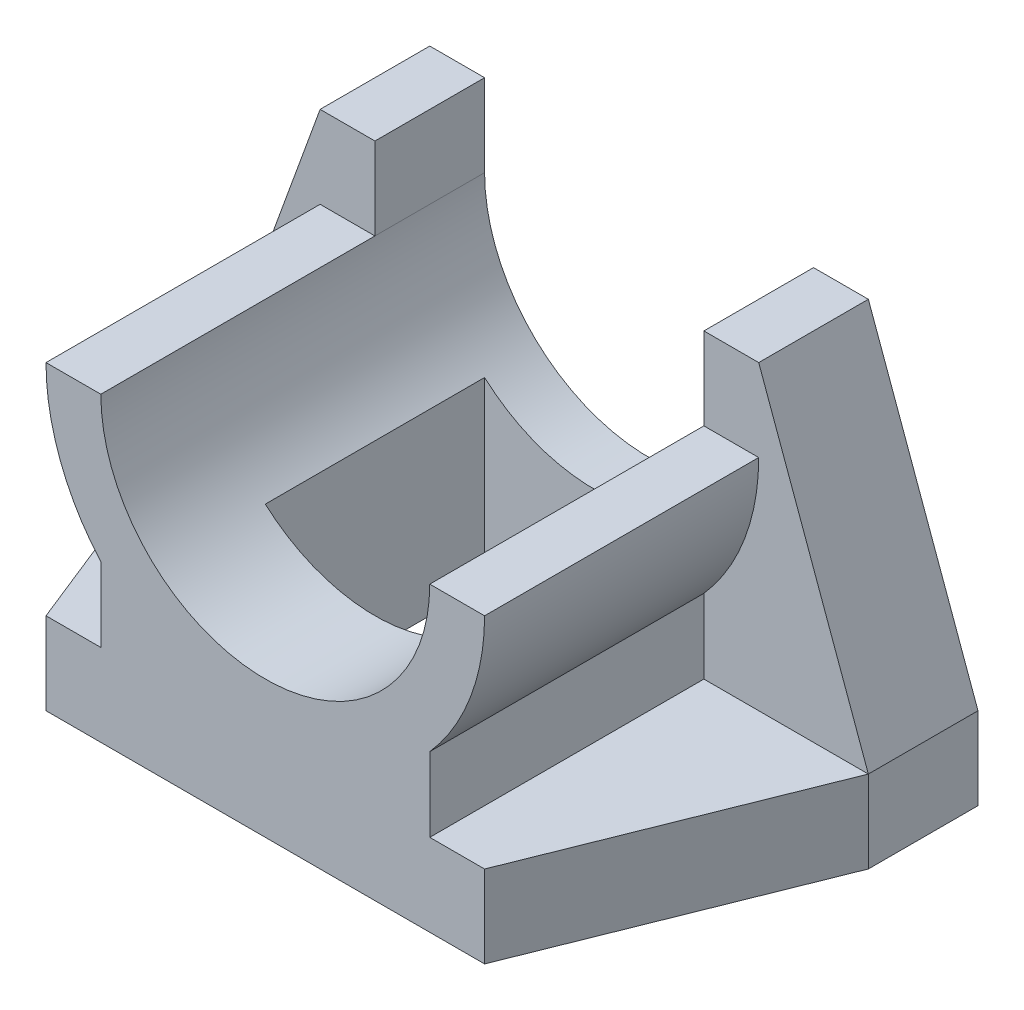
ISO-10303-21;
HEADER;
FILE_DESCRIPTION(('STEP AP214'),'2;1');
FILE_NAME('part.step','',(''),(''),'','','');
FILE_SCHEMA(('AUTOMOTIVE_DESIGN { 1 0 10303 214 1 1 1 1 }'));
ENDSEC;
DATA;
#1=APPLICATION_CONTEXT('core data for automotive mechanical design processes');
#2=APPLICATION_PROTOCOL_DEFINITION('international standard','automotive_design',2000,#1);
#3=PRODUCT_CONTEXT('',#1,'mechanical');
#4=PRODUCT('Part','Part','',(#3));
#5=PRODUCT_RELATED_PRODUCT_CATEGORY('part','',(#4));
#6=PRODUCT_DEFINITION_FORMATION('','',#4);
#7=PRODUCT_DEFINITION_CONTEXT('part definition',#1,'design');
#8=PRODUCT_DEFINITION('design','',#6,#7);
#9=PRODUCT_DEFINITION_SHAPE('','',#8);
#10=(LENGTH_UNIT() NAMED_UNIT(*) SI_UNIT(.MILLI.,.METRE.));
#11=(NAMED_UNIT(*) PLANE_ANGLE_UNIT() SI_UNIT($,.RADIAN.));
#12=(NAMED_UNIT(*) SI_UNIT($,.STERADIAN.) SOLID_ANGLE_UNIT());
#13=UNCERTAINTY_MEASURE_WITH_UNIT(LENGTH_MEASURE(1.E-05),#10,'distance_accuracy_value','');
#14=(GEOMETRIC_REPRESENTATION_CONTEXT(3) GLOBAL_UNCERTAINTY_ASSIGNED_CONTEXT((#13)) GLOBAL_UNIT_ASSIGNED_CONTEXT((#10,
#11,#12)) REPRESENTATION_CONTEXT('',''));
#15=CARTESIAN_POINT('',(0.,0.,0.));
#16=DIRECTION('',(0.,0.,1.));
#17=DIRECTION('',(1.,0.,0.));
#18=AXIS2_PLACEMENT_3D('',#15,#16,#17);
#19=CARTESIAN_POINT('',(0.,0.,0.));
#20=DIRECTION('',(0.,1.,0.));
#21=DIRECTION('',(0.,0.,1.));
#22=AXIS2_PLACEMENT_3D('',#19,#20,#21);
#23=PLANE('',#22);
#24=DIRECTION('',(-0.371390676354104,0.,0.928476690885259));
#25=VECTOR('',#24,1.);
#26=CARTESIAN_POINT('',(40.,0.,70.));
#27=LINE('',#26,#25);
#28=CARTESIAN_POINT('',(60.,0.,20.));
#29=VERTEX_POINT('',#28);
#30=CARTESIAN_POINT('',(40.,0.,70.));
#31=VERTEX_POINT('',#30);
#32=EDGE_CURVE('E268',#29,#31,#27,.T.);
#33=ORIENTED_EDGE('',*,*,#32,.T.);
#34=DIRECTION('',(1.,0.,0.));
#35=VECTOR('',#34,1.);
#36=CARTESIAN_POINT('',(-40.,0.,70.));
#37=LINE('',#36,#35);
#38=CARTESIAN_POINT('',(-40.,0.,70.));
#39=VERTEX_POINT('',#38);
#40=EDGE_CURVE('E350',#39,#31,#37,.T.);
#41=ORIENTED_EDGE('',*,*,#40,.F.);
#42=DIRECTION('',(0.371390676354104,0.,0.928476690885259));
#43=VECTOR('',#42,1.);
#44=CARTESIAN_POINT('',(-40.,0.,70.));
#45=LINE('',#44,#43);
#46=CARTESIAN_POINT('',(-60.,0.,20.));
#47=VERTEX_POINT('',#46);
#48=EDGE_CURVE('E310',#47,#39,#45,.T.);
#49=ORIENTED_EDGE('',*,*,#48,.F.);
#50=DIRECTION('',(0.,0.,1.));
#51=VECTOR('',#50,1.);
#52=CARTESIAN_POINT('',(-60.,0.,20.));
#53=LINE('',#52,#51);
#54=CARTESIAN_POINT('',(-60.,0.,0.));
#55=VERTEX_POINT('',#54);
#56=EDGE_CURVE('E301',#55,#47,#53,.T.);
#57=ORIENTED_EDGE('',*,*,#56,.F.);
#58=DIRECTION('',(-1.,0.,0.));
#59=VECTOR('',#58,1.);
#60=CARTESIAN_POINT('',(-40.,0.,0.));
#61=LINE('',#60,#59);
#62=CARTESIAN_POINT('',(60.,0.,0.));
#63=VERTEX_POINT('',#62);
#64=EDGE_CURVE('E352',#63,#55,#61,.T.);
#65=ORIENTED_EDGE('',*,*,#64,.F.);
#66=DIRECTION('',(0.,0.,1.));
#67=VECTOR('',#66,1.);
#68=CARTESIAN_POINT('',(60.,0.,20.));
#69=LINE('',#68,#67);
#70=EDGE_CURVE('E263',#63,#29,#69,.T.);
#71=ORIENTED_EDGE('',*,*,#70,.T.);
#72=EDGE_LOOP('',(#33,#41,#49,#57,#65,#71));
#73=FACE_BOUND('',#72,.T.);
#74=DIRECTION('',(0.,0.,1.));
#75=VECTOR('',#74,1.);
#76=CARTESIAN_POINT('',(-20.,0.,10.));
#77=LINE('',#76,#75);
#78=CARTESIAN_POINT('',(-20.,0.,10.));
#79=VERTEX_POINT('',#78);
#80=CARTESIAN_POINT('',(-20.,0.,50.));
#81=VERTEX_POINT('',#80);
#82=EDGE_CURVE('E59',#79,#81,#77,.T.);
#83=ORIENTED_EDGE('',*,*,#82,.T.);
#84=DIRECTION('',(1.,0.,0.));
#85=VECTOR('',#84,1.);
#86=CARTESIAN_POINT('',(-20.,0.,50.));
#87=LINE('',#86,#85);
#88=CARTESIAN_POINT('',(20.,0.,50.));
#89=VERTEX_POINT('',#88);
#90=EDGE_CURVE('E206',#81,#89,#87,.T.);
#91=ORIENTED_EDGE('',*,*,#90,.T.);
#92=DIRECTION('',(0.,0.,-1.));
#93=VECTOR('',#92,1.);
#94=CARTESIAN_POINT('',(20.,0.,10.));
#95=LINE('',#94,#93);
#96=CARTESIAN_POINT('',(20.,0.,10.));
#97=VERTEX_POINT('',#96);
#98=EDGE_CURVE('E215',#89,#97,#95,.T.);
#99=ORIENTED_EDGE('',*,*,#98,.T.);
#100=DIRECTION('',(-1.,0.,0.));
#101=VECTOR('',#100,1.);
#102=CARTESIAN_POINT('',(-20.,0.,10.));
#103=LINE('',#102,#101);
#104=EDGE_CURVE('E214',#97,#79,#103,.T.);
#105=ORIENTED_EDGE('',*,*,#104,.T.);
#106=EDGE_LOOP('',(#83,#91,#99,#105));
#107=FACE_BOUND('',#106,.T.);
#108=ADVANCED_FACE('F43',(#73,#107),#23,.F.);
#109=CARTESIAN_POINT('',(0.,55.,70.));
#110=DIRECTION('',(0.,0.,-1.));
#111=DIRECTION('',(-1.,0.,0.));
#112=AXIS2_PLACEMENT_3D('',#109,#110,#111);
#113=CYLINDRICAL_SURFACE('',#112,30.);
#114=CARTESIAN_POINT('',(0.,55.,0.));
#115=DIRECTION('',(0.,0.,1.));
#116=DIRECTION('',(1.,0.,0.));
#117=AXIS2_PLACEMENT_3D('',#114,#115,#116);
#118=CIRCLE('',#117,30.);
#119=CARTESIAN_POINT('',(-30.,55.,0.));
#120=VERTEX_POINT('',#119);
#121=CARTESIAN_POINT('',(30.,55.,0.));
#122=VERTEX_POINT('',#121);
#123=EDGE_CURVE('E205',#120,#122,#118,.T.);
#124=ORIENTED_EDGE('',*,*,#123,.F.);
#125=DIRECTION('',(0.,0.,-1.));
#126=VECTOR('',#125,1.);
#127=CARTESIAN_POINT('',(-30.,55.,70.));
#128=LINE('',#127,#126);
#129=CARTESIAN_POINT('',(-30.,55.,20.));
#130=VERTEX_POINT('',#129);
#131=EDGE_CURVE('E370',#130,#120,#128,.T.);
#132=ORIENTED_EDGE('',*,*,#131,.F.);
#133=DIRECTION('',(0.,0.,-1.));
#134=VECTOR('',#133,1.);
#135=CARTESIAN_POINT('',(-30.,55.,70.));
#136=LINE('',#135,#134);
#137=CARTESIAN_POINT('',(-30.,55.,70.));
#138=VERTEX_POINT('',#137);
#139=EDGE_CURVE('E228',#138,#130,#136,.T.);
#140=ORIENTED_EDGE('',*,*,#139,.F.);
#141=CARTESIAN_POINT('',(0.,55.,70.));
#142=DIRECTION('',(0.,0.,1.));
#143=DIRECTION('',(1.,0.,0.));
#144=AXIS2_PLACEMENT_3D('',#141,#142,#143);
#145=CIRCLE('',#144,30.);
#146=CARTESIAN_POINT('',(30.,55.,70.));
#147=VERTEX_POINT('',#146);
#148=EDGE_CURVE('E221',#138,#147,#145,.T.);
#149=ORIENTED_EDGE('',*,*,#148,.T.);
#150=DIRECTION('',(0.,0.,-1.));
#151=VECTOR('',#150,1.);
#152=CARTESIAN_POINT('',(30.,55.,70.));
#153=LINE('',#152,#151);
#154=CARTESIAN_POINT('',(30.,55.,20.));
#155=VERTEX_POINT('',#154);
#156=EDGE_CURVE('E232',#147,#155,#153,.T.);
#157=ORIENTED_EDGE('',*,*,#156,.T.);
#158=DIRECTION('',(0.,0.,-1.));
#159=VECTOR('',#158,1.);
#160=CARTESIAN_POINT('',(30.,55.,70.));
#161=LINE('',#160,#159);
#162=EDGE_CURVE('E261',#155,#122,#161,.T.);
#163=ORIENTED_EDGE('',*,*,#162,.T.);
#164=EDGE_LOOP('',(#124,#132,#140,#149,#157,#163));
#165=FACE_BOUND('',#164,.T.);
#166=CARTESIAN_POINT('',(0.,55.,50.));
#167=DIRECTION('',(0.,0.,-1.));
#168=DIRECTION('',(-1.,0.,0.));
#169=AXIS2_PLACEMENT_3D('',#166,#167,#168);
#170=CIRCLE('',#169,30.);
#171=CARTESIAN_POINT('',(20.,32.6393202250021,50.));
#172=VERTEX_POINT('',#171);
#173=CARTESIAN_POINT('',(-20.,32.6393202250021,50.));
#174=VERTEX_POINT('',#173);
#175=EDGE_CURVE('E51',#172,#174,#170,.T.);
#176=ORIENTED_EDGE('',*,*,#175,.T.);
#177=DIRECTION('',(0.,0.,-1.));
#178=VECTOR('',#177,1.);
#179=CARTESIAN_POINT('',(-20.,32.6393202250021,70.));
#180=LINE('',#179,#178);
#181=CARTESIAN_POINT('',(-20.,32.6393202250021,10.));
#182=VERTEX_POINT('',#181);
#183=EDGE_CURVE('E11',#174,#182,#180,.T.);
#184=ORIENTED_EDGE('',*,*,#183,.T.);
#185=CARTESIAN_POINT('',(0.,55.,10.));
#186=DIRECTION('',(0.,0.,1.));
#187=DIRECTION('',(1.,0.,0.));
#188=AXIS2_PLACEMENT_3D('',#185,#186,#187);
#189=CIRCLE('',#188,30.);
#190=CARTESIAN_POINT('',(20.,32.6393202250021,10.));
#191=VERTEX_POINT('',#190);
#192=EDGE_CURVE('E373',#182,#191,#189,.T.);
#193=ORIENTED_EDGE('',*,*,#192,.T.);
#194=DIRECTION('',(0.,0.,-1.));
#195=VECTOR('',#194,1.);
#196=CARTESIAN_POINT('',(20.,32.6393202250021,70.));
#197=LINE('',#196,#195);
#198=EDGE_CURVE('E376',#191,#172,#197,.F.);
#199=ORIENTED_EDGE('',*,*,#198,.T.);
#200=EDGE_LOOP('',(#176,#184,#193,#199));
#201=FACE_BOUND('',#200,.T.);
#202=ADVANCED_FACE('F377',(#165,#201),#113,.F.);
#203=CARTESIAN_POINT('',(40.,55.,70.));
#204=DIRECTION('',(0.,-1.,0.));
#205=DIRECTION('',(0.,0.,-1.));
#206=AXIS2_PLACEMENT_3D('',#203,#204,#205);
#207=PLANE('',#206);
#208=ORIENTED_EDGE('',*,*,#156,.F.);
#209=DIRECTION('',(-1.,0.,0.));
#210=VECTOR('',#209,1.);
#211=CARTESIAN_POINT('',(40.,55.,70.));
#212=LINE('',#211,#210);
#213=CARTESIAN_POINT('',(40.,55.,70.));
#214=VERTEX_POINT('',#213);
#215=EDGE_CURVE('E329',#214,#147,#212,.T.);
#216=ORIENTED_EDGE('',*,*,#215,.F.);
#217=DIRECTION('',(0.,0.,-1.));
#218=VECTOR('',#217,1.);
#219=CARTESIAN_POINT('',(40.,55.,70.));
#220=LINE('',#219,#218);
#221=CARTESIAN_POINT('',(40.,55.,20.));
#222=VERTEX_POINT('',#221);
#223=EDGE_CURVE('E342',#214,#222,#220,.T.);
#224=ORIENTED_EDGE('',*,*,#223,.T.);
#225=DIRECTION('',(-1.,0.,0.));
#226=VECTOR('',#225,1.);
#227=CARTESIAN_POINT('',(40.,55.,20.));
#228=LINE('',#227,#226);
#229=EDGE_CURVE('E256',#222,#155,#228,.T.);
#230=ORIENTED_EDGE('',*,*,#229,.T.);
#231=EDGE_LOOP('',(#208,#216,#224,#230));
#232=FACE_BOUND('',#231,.T.);
#233=ADVANCED_FACE('F397',(#232),#207,.F.);
#234=CARTESIAN_POINT('',(-40.,15.,0.));
#235=DIRECTION('',(0.,0.,1.));
#236=DIRECTION('',(1.,0.,0.));
#237=AXIS2_PLACEMENT_3D('',#234,#235,#236);
#238=PLANE('',#237);
#239=DIRECTION('',(0.,1.,0.));
#240=VECTOR('',#239,1.);
#241=CARTESIAN_POINT('',(-30.,15.,0.));
#242=LINE('',#241,#240);
#243=CARTESIAN_POINT('',(-30.,70.,0.));
#244=VERTEX_POINT('',#243);
#245=EDGE_CURVE('E291',#120,#244,#242,.T.);
#246=ORIENTED_EDGE('',*,*,#245,.F.);
#247=ORIENTED_EDGE('',*,*,#123,.T.);
#248=DIRECTION('',(0.,1.,0.));
#249=VECTOR('',#248,1.);
#250=CARTESIAN_POINT('',(30.,15.,0.));
#251=LINE('',#250,#249);
#252=CARTESIAN_POINT('',(30.,70.,0.));
#253=VERTEX_POINT('',#252);
#254=EDGE_CURVE('E240',#122,#253,#251,.T.);
#255=ORIENTED_EDGE('',*,*,#254,.T.);
#256=DIRECTION('',(1.,0.,0.));
#257=VECTOR('',#256,1.);
#258=CARTESIAN_POINT('',(30.,70.,0.));
#259=LINE('',#258,#257);
#260=CARTESIAN_POINT('',(40.,70.,0.));
#261=VERTEX_POINT('',#260);
#262=EDGE_CURVE('E248',#253,#261,#259,.T.);
#263=ORIENTED_EDGE('',*,*,#262,.T.);
#264=DIRECTION('',(0.341743063086704,-0.939793423488437,0.));
#265=VECTOR('',#264,1.);
#266=CARTESIAN_POINT('',(40.,70.,0.));
#267=LINE('',#266,#265);
#268=CARTESIAN_POINT('',(60.,15.,0.));
#269=VERTEX_POINT('',#268);
#270=EDGE_CURVE('E234',#261,#269,#267,.T.);
#271=ORIENTED_EDGE('',*,*,#270,.T.);
#272=DIRECTION('',(0.,-1.,0.));
#273=VECTOR('',#272,1.);
#274=CARTESIAN_POINT('',(60.,15.,0.));
#275=LINE('',#274,#273);
#276=EDGE_CURVE('E280',#269,#63,#275,.T.);
#277=ORIENTED_EDGE('',*,*,#276,.T.);
#278=ORIENTED_EDGE('',*,*,#64,.T.);
#279=DIRECTION('',(0.,-1.,0.));
#280=VECTOR('',#279,1.);
#281=CARTESIAN_POINT('',(-60.,15.,0.));
#282=LINE('',#281,#280);
#283=CARTESIAN_POINT('',(-60.,15.,0.));
#284=VERTEX_POINT('',#283);
#285=EDGE_CURVE('E315',#284,#55,#282,.T.);
#286=ORIENTED_EDGE('',*,*,#285,.F.);
#287=DIRECTION('',(-0.341743063086704,-0.939793423488437,0.));
#288=VECTOR('',#287,1.);
#289=CARTESIAN_POINT('',(-40.,70.,0.));
#290=LINE('',#289,#288);
#291=CARTESIAN_POINT('',(-40.,70.,0.));
#292=VERTEX_POINT('',#291);
#293=EDGE_CURVE('E278',#292,#284,#290,.T.);
#294=ORIENTED_EDGE('',*,*,#293,.F.);
#295=DIRECTION('',(-1.,0.,0.));
#296=VECTOR('',#295,1.);
#297=CARTESIAN_POINT('',(-30.,70.,0.));
#298=LINE('',#297,#296);
#299=EDGE_CURVE('E285',#244,#292,#298,.T.);
#300=ORIENTED_EDGE('',*,*,#299,.F.);
#301=EDGE_LOOP('',(#246,#247,#255,#263,#271,#277,#278,#286,#294,#300));
#302=FACE_BOUND('',#301,.T.);
#303=ADVANCED_FACE('F405',(#302),#238,.F.);
#304=CARTESIAN_POINT('',(0.,15.,0.));
#305=DIRECTION('',(0.,1.,0.));
#306=DIRECTION('',(0.,0.,1.));
#307=AXIS2_PLACEMENT_3D('',#304,#305,#306);
#308=PLANE('',#307);
#309=DIRECTION('',(-0.371390676354104,0.,0.928476690885259));
#310=VECTOR('',#309,1.);
#311=CARTESIAN_POINT('',(40.,15.,70.));
#312=LINE('',#311,#310);
#313=CARTESIAN_POINT('',(60.,15.,20.));
#314=VERTEX_POINT('',#313);
#315=CARTESIAN_POINT('',(40.,15.,70.));
#316=VERTEX_POINT('',#315);
#317=EDGE_CURVE('E270',#314,#316,#312,.T.);
#318=ORIENTED_EDGE('',*,*,#317,.F.);
#319=DIRECTION('',(-1.,0.,0.));
#320=VECTOR('',#319,1.);
#321=CARTESIAN_POINT('',(60.,15.,20.));
#322=LINE('',#321,#320);
#323=CARTESIAN_POINT('',(30.,15.,20.));
#324=VERTEX_POINT('',#323);
#325=EDGE_CURVE('E245',#314,#324,#322,.T.);
#326=ORIENTED_EDGE('',*,*,#325,.T.);
#327=DIRECTION('',(0.,0.,1.));
#328=VECTOR('',#327,1.);
#329=CARTESIAN_POINT('',(30.,15.,0.));
#330=LINE('',#329,#328);
#331=CARTESIAN_POINT('',(30.,15.,70.));
#332=VERTEX_POINT('',#331);
#333=EDGE_CURVE('E356',#324,#332,#330,.T.);
#334=ORIENTED_EDGE('',*,*,#333,.T.);
#335=DIRECTION('',(1.,0.,0.));
#336=VECTOR('',#335,1.);
#337=CARTESIAN_POINT('',(-40.,15.,70.));
#338=LINE('',#337,#336);
#339=EDGE_CURVE('E353',#332,#316,#338,.T.);
#340=ORIENTED_EDGE('',*,*,#339,.T.);
#341=EDGE_LOOP('',(#318,#326,#334,#340));
#342=FACE_BOUND('',#341,.T.);
#343=ADVANCED_FACE('F404',(#342),#308,.T.);
#344=CARTESIAN_POINT('',(-30.,28.5424868893541,70.));
#345=DIRECTION('',(1.,0.,0.));
#346=DIRECTION('',(0.,0.,-1.));
#347=AXIS2_PLACEMENT_3D('',#344,#345,#346);
#348=PLANE('',#347);
#349=DIRECTION('',(0.,1.,0.));
#350=VECTOR('',#349,1.);
#351=CARTESIAN_POINT('',(-30.,15.,20.));
#352=LINE('',#351,#350);
#353=CARTESIAN_POINT('',(-30.,15.,20.));
#354=VERTEX_POINT('',#353);
#355=CARTESIAN_POINT('',(-30.,28.5424868893541,20.));
#356=VERTEX_POINT('',#355);
#357=EDGE_CURVE('E290',#354,#356,#352,.T.);
#358=ORIENTED_EDGE('',*,*,#357,.F.);
#359=DIRECTION('',(0.,0.,-1.));
#360=VECTOR('',#359,1.);
#361=CARTESIAN_POINT('',(-30.,15.,0.));
#362=LINE('',#361,#360);
#363=CARTESIAN_POINT('',(-30.,15.,70.));
#364=VERTEX_POINT('',#363);
#365=EDGE_CURVE('E363',#364,#354,#362,.T.);
#366=ORIENTED_EDGE('',*,*,#365,.F.);
#367=DIRECTION('',(0.,-1.,0.));
#368=VECTOR('',#367,1.);
#369=CARTESIAN_POINT('',(-30.,28.5424868893541,70.));
#370=LINE('',#369,#368);
#371=CARTESIAN_POINT('',(-30.,28.5424868893541,70.));
#372=VERTEX_POINT('',#371);
#373=EDGE_CURVE('E325',#372,#364,#370,.T.);
#374=ORIENTED_EDGE('',*,*,#373,.F.);
#375=DIRECTION('',(0.,0.,-1.));
#376=VECTOR('',#375,1.);
#377=CARTESIAN_POINT('',(-30.,28.5424868893541,70.));
#378=LINE('',#377,#376);
#379=EDGE_CURVE('E333',#372,#356,#378,.T.);
#380=ORIENTED_EDGE('',*,*,#379,.T.);
#381=EDGE_LOOP('',(#358,#366,#374,#380));
#382=FACE_BOUND('',#381,.T.);
#383=ADVANCED_FACE('F412',(#382),#348,.F.);
#384=CARTESIAN_POINT('',(-40.,55.,70.));
#385=VERTEX_POINT('',#384);
#386=EDGE_CURVE('E328',#138,#385,#212,.T.);
#387=ORIENTED_EDGE('',*,*,#386,.F.);
#388=ORIENTED_EDGE('',*,*,#139,.T.);
#389=DIRECTION('',(-1.,0.,0.));
#390=VECTOR('',#389,1.);
#391=CARTESIAN_POINT('',(40.,55.,20.));
#392=LINE('',#391,#390);
#393=CARTESIAN_POINT('',(-40.,55.,20.));
#394=VERTEX_POINT('',#393);
#395=EDGE_CURVE('E302',#130,#394,#392,.T.);
#396=ORIENTED_EDGE('',*,*,#395,.T.);
#397=DIRECTION('',(0.,0.,-1.));
#398=VECTOR('',#397,1.);
#399=CARTESIAN_POINT('',(-40.,55.,70.));
#400=LINE('',#399,#398);
#401=EDGE_CURVE('E337',#385,#394,#400,.T.);
#402=ORIENTED_EDGE('',*,*,#401,.F.);
#403=EDGE_LOOP('',(#387,#388,#396,#402));
#404=FACE_BOUND('',#403,.T.);
#405=ADVANCED_FACE('F413',(#404),#207,.F.);
#406=DIRECTION('',(1.,0.,0.));
#407=VECTOR('',#406,1.);
#408=CARTESIAN_POINT('',(-60.,15.,20.));
#409=LINE('',#408,#407);
#410=CARTESIAN_POINT('',(-60.,15.,20.));
#411=VERTEX_POINT('',#410);
#412=EDGE_CURVE('E282',#411,#354,#409,.T.);
#413=ORIENTED_EDGE('',*,*,#412,.F.);
#414=DIRECTION('',(0.371390676354104,0.,0.928476690885259));
#415=VECTOR('',#414,1.);
#416=CARTESIAN_POINT('',(-40.,15.,70.));
#417=LINE('',#416,#415);
#418=CARTESIAN_POINT('',(-40.,15.,70.));
#419=VERTEX_POINT('',#418);
#420=EDGE_CURVE('E306',#411,#419,#417,.T.);
#421=ORIENTED_EDGE('',*,*,#420,.T.);
#422=EDGE_CURVE('E346',#419,#364,#338,.T.);
#423=ORIENTED_EDGE('',*,*,#422,.T.);
#424=ORIENTED_EDGE('',*,*,#365,.T.);
#425=EDGE_LOOP('',(#413,#421,#423,#424));
#426=FACE_BOUND('',#425,.T.);
#427=ADVANCED_FACE('F398',(#426),#308,.T.);
#428=CARTESIAN_POINT('',(-40.,15.,70.));
#429=DIRECTION('',(0.,0.,-1.));
#430=DIRECTION('',(-1.,0.,0.));
#431=AXIS2_PLACEMENT_3D('',#428,#429,#430);
#432=PLANE('',#431);
#433=ORIENTED_EDGE('',*,*,#148,.F.);
#434=ORIENTED_EDGE('',*,*,#386,.T.);
#435=CARTESIAN_POINT('',(0.,55.,70.));
#436=DIRECTION('',(0.,0.,1.));
#437=DIRECTION('',(1.,0.,0.));
#438=AXIS2_PLACEMENT_3D('',#435,#436,#437);
#439=CIRCLE('',#438,40.);
#440=EDGE_CURVE('E334',#385,#372,#439,.T.);
#441=ORIENTED_EDGE('',*,*,#440,.T.);
#442=ORIENTED_EDGE('',*,*,#373,.T.);
#443=ORIENTED_EDGE('',*,*,#422,.F.);
#444=DIRECTION('',(0.,-1.,0.));
#445=VECTOR('',#444,1.);
#446=CARTESIAN_POINT('',(-40.,15.,70.));
#447=LINE('',#446,#445);
#448=EDGE_CURVE('E360',#419,#39,#447,.T.);
#449=ORIENTED_EDGE('',*,*,#448,.T.);
#450=ORIENTED_EDGE('',*,*,#40,.T.);
#451=DIRECTION('',(0.,-1.,0.));
#452=VECTOR('',#451,1.);
#453=CARTESIAN_POINT('',(40.,15.,70.));
#454=LINE('',#453,#452);
#455=EDGE_CURVE('E348',#316,#31,#454,.T.);
#456=ORIENTED_EDGE('',*,*,#455,.F.);
#457=ORIENTED_EDGE('',*,*,#339,.F.);
#458=DIRECTION('',(0.,1.,0.));
#459=VECTOR('',#458,1.);
#460=CARTESIAN_POINT('',(30.,10.,70.));
#461=LINE('',#460,#459);
#462=CARTESIAN_POINT('',(30.,28.5424868893541,70.));
#463=VERTEX_POINT('',#462);
#464=EDGE_CURVE('E324',#332,#463,#461,.T.);
#465=ORIENTED_EDGE('',*,*,#464,.T.);
#466=CARTESIAN_POINT('',(0.,55.,70.));
#467=DIRECTION('',(0.,0.,1.));
#468=DIRECTION('',(1.,0.,0.));
#469=AXIS2_PLACEMENT_3D('',#466,#467,#468);
#470=CIRCLE('',#469,40.);
#471=EDGE_CURVE('E330',#463,#214,#470,.T.);
#472=ORIENTED_EDGE('',*,*,#471,.T.);
#473=ORIENTED_EDGE('',*,*,#215,.T.);
#474=EDGE_LOOP('',(#433,#434,#441,#442,#443,#449,#450,#456,#457,#465,#472,#473));
#475=FACE_BOUND('',#474,.T.);
#476=ADVANCED_FACE('F44',(#475),#432,.F.);
#477=CARTESIAN_POINT('',(30.,10.,70.));
#478=DIRECTION('',(-1.,0.,0.));
#479=DIRECTION('',(0.,0.,1.));
#480=AXIS2_PLACEMENT_3D('',#477,#478,#479);
#481=PLANE('',#480);
#482=ORIENTED_EDGE('',*,*,#333,.F.);
#483=DIRECTION('',(0.,1.,0.));
#484=VECTOR('',#483,1.);
#485=CARTESIAN_POINT('',(30.,15.,20.));
#486=LINE('',#485,#484);
#487=CARTESIAN_POINT('',(30.,28.5424868893541,20.));
#488=VERTEX_POINT('',#487);
#489=EDGE_CURVE('E243',#324,#488,#486,.T.);
#490=ORIENTED_EDGE('',*,*,#489,.T.);
#491=DIRECTION('',(0.,0.,-1.));
#492=VECTOR('',#491,1.);
#493=CARTESIAN_POINT('',(30.,28.5424868893541,70.));
#494=LINE('',#493,#492);
#495=EDGE_CURVE('E341',#463,#488,#494,.T.);
#496=ORIENTED_EDGE('',*,*,#495,.F.);
#497=ORIENTED_EDGE('',*,*,#464,.F.);
#498=EDGE_LOOP('',(#482,#490,#496,#497));
#499=FACE_BOUND('',#498,.T.);
#500=ADVANCED_FACE('F460',(#499),#481,.F.);
#501=CARTESIAN_POINT('',(0.,55.,70.));
#502=DIRECTION('',(0.,0.,-1.));
#503=DIRECTION('',(-1.,0.,0.));
#504=AXIS2_PLACEMENT_3D('',#501,#502,#503);
#505=CYLINDRICAL_SURFACE('',#504,40.);
#506=ORIENTED_EDGE('',*,*,#495,.T.);
#507=CARTESIAN_POINT('',(0.,55.,20.));
#508=DIRECTION('',(0.,0.,1.));
#509=DIRECTION('',(1.,0.,0.));
#510=AXIS2_PLACEMENT_3D('',#507,#508,#509);
#511=CIRCLE('',#510,40.);
#512=EDGE_CURVE('E367',#488,#222,#511,.T.);
#513=ORIENTED_EDGE('',*,*,#512,.T.);
#514=ORIENTED_EDGE('',*,*,#223,.F.);
#515=ORIENTED_EDGE('',*,*,#471,.F.);
#516=EDGE_LOOP('',(#506,#513,#514,#515));
#517=FACE_BOUND('',#516,.T.);
#518=ADVANCED_FACE('F452',(#517),#505,.T.);
#519=CARTESIAN_POINT('',(0.,55.,70.));
#520=DIRECTION('',(0.,0.,-1.));
#521=DIRECTION('',(-1.,0.,0.));
#522=AXIS2_PLACEMENT_3D('',#519,#520,#521);
#523=CYLINDRICAL_SURFACE('',#522,40.);
#524=ORIENTED_EDGE('',*,*,#401,.T.);
#525=CARTESIAN_POINT('',(0.,55.,20.));
#526=DIRECTION('',(0.,0.,1.));
#527=DIRECTION('',(1.,0.,0.));
#528=AXIS2_PLACEMENT_3D('',#525,#526,#527);
#529=CIRCLE('',#528,40.);
#530=EDGE_CURVE('E365',#394,#356,#529,.T.);
#531=ORIENTED_EDGE('',*,*,#530,.T.);
#532=ORIENTED_EDGE('',*,*,#379,.F.);
#533=ORIENTED_EDGE('',*,*,#440,.F.);
#534=EDGE_LOOP('',(#524,#531,#532,#533));
#535=FACE_BOUND('',#534,.T.);
#536=ADVANCED_FACE('F440',(#535),#523,.T.);
#537=CARTESIAN_POINT('',(-60.,15.,20.));
#538=DIRECTION('',(1.,0.,0.));
#539=DIRECTION('',(0.,0.,-1.));
#540=AXIS2_PLACEMENT_3D('',#537,#538,#539);
#541=PLANE('',#540);
#542=ORIENTED_EDGE('',*,*,#56,.T.);
#543=DIRECTION('',(0.,-1.,0.));
#544=VECTOR('',#543,1.);
#545=CARTESIAN_POINT('',(-60.,15.,20.));
#546=LINE('',#545,#544);
#547=EDGE_CURVE('E317',#411,#47,#546,.T.);
#548=ORIENTED_EDGE('',*,*,#547,.F.);
#549=DIRECTION('',(0.,0.,1.));
#550=VECTOR('',#549,1.);
#551=CARTESIAN_POINT('',(-60.,15.,20.));
#552=LINE('',#551,#550);
#553=EDGE_CURVE('E303',#284,#411,#552,.T.);
#554=ORIENTED_EDGE('',*,*,#553,.F.);
#555=ORIENTED_EDGE('',*,*,#285,.T.);
#556=EDGE_LOOP('',(#542,#548,#554,#555));
#557=FACE_BOUND('',#556,.T.);
#558=ADVANCED_FACE('F510',(#557),#541,.F.);
#559=CARTESIAN_POINT('',(-40.,15.,70.));
#560=DIRECTION('',(0.928476690885259,0.,-0.371390676354104));
#561=DIRECTION('',(-0.371390676354104,0.,-0.92847669088526));
#562=AXIS2_PLACEMENT_3D('',#559,#560,#561);
#563=PLANE('',#562);
#564=ORIENTED_EDGE('',*,*,#48,.T.);
#565=ORIENTED_EDGE('',*,*,#448,.F.);
#566=ORIENTED_EDGE('',*,*,#420,.F.);
#567=ORIENTED_EDGE('',*,*,#547,.T.);
#568=EDGE_LOOP('',(#564,#565,#566,#567));
#569=FACE_BOUND('',#568,.T.);
#570=ADVANCED_FACE('F503',(#569),#563,.F.);
#571=CARTESIAN_POINT('',(-30.,15.,20.));
#572=DIRECTION('',(-1.,0.,0.));
#573=DIRECTION('',(0.,0.,1.));
#574=AXIS2_PLACEMENT_3D('',#571,#572,#573);
#575=PLANE('',#574);
#576=CARTESIAN_POINT('',(-30.,70.,20.));
#577=VERTEX_POINT('',#576);
#578=EDGE_CURVE('E287',#130,#577,#352,.T.);
#579=ORIENTED_EDGE('',*,*,#578,.F.);
#580=ORIENTED_EDGE('',*,*,#131,.T.);
#581=ORIENTED_EDGE('',*,*,#245,.T.);
#582=DIRECTION('',(0.,0.,-1.));
#583=VECTOR('',#582,1.);
#584=CARTESIAN_POINT('',(-30.,70.,20.));
#585=LINE('',#584,#583);
#586=EDGE_CURVE('E297',#577,#244,#585,.T.);
#587=ORIENTED_EDGE('',*,*,#586,.F.);
#588=EDGE_LOOP('',(#579,#580,#581,#587));
#589=FACE_BOUND('',#588,.T.);
#590=ADVANCED_FACE('F421',(#589),#575,.F.);
#591=CARTESIAN_POINT('',(-40.,70.,20.));
#592=DIRECTION('',(0.939793423488437,-0.341743063086704,0.));
#593=DIRECTION('',(0.341743063086704,0.939793423488437,0.));
#594=AXIS2_PLACEMENT_3D('',#591,#592,#593);
#595=PLANE('',#594);
#596=ORIENTED_EDGE('',*,*,#293,.T.);
#597=ORIENTED_EDGE('',*,*,#553,.T.);
#598=DIRECTION('',(-0.341743063086704,-0.939793423488437,0.));
#599=VECTOR('',#598,1.);
#600=CARTESIAN_POINT('',(-40.,70.,20.));
#601=LINE('',#600,#599);
#602=CARTESIAN_POINT('',(-40.,70.,20.));
#603=VERTEX_POINT('',#602);
#604=EDGE_CURVE('E283',#603,#411,#601,.T.);
#605=ORIENTED_EDGE('',*,*,#604,.F.);
#606=DIRECTION('',(0.,0.,-1.));
#607=VECTOR('',#606,1.);
#608=CARTESIAN_POINT('',(-40.,70.,20.));
#609=LINE('',#608,#607);
#610=EDGE_CURVE('E292',#603,#292,#609,.T.);
#611=ORIENTED_EDGE('',*,*,#610,.T.);
#612=EDGE_LOOP('',(#596,#597,#605,#611));
#613=FACE_BOUND('',#612,.T.);
#614=ADVANCED_FACE('F499',(#613),#595,.F.);
#615=CARTESIAN_POINT('',(-30.,70.,20.));
#616=DIRECTION('',(0.,-1.,0.));
#617=DIRECTION('',(0.,0.,-1.));
#618=AXIS2_PLACEMENT_3D('',#615,#616,#617);
#619=PLANE('',#618);
#620=ORIENTED_EDGE('',*,*,#299,.T.);
#621=ORIENTED_EDGE('',*,*,#610,.F.);
#622=DIRECTION('',(-1.,0.,0.));
#623=VECTOR('',#622,1.);
#624=CARTESIAN_POINT('',(-30.,70.,20.));
#625=LINE('',#624,#623);
#626=EDGE_CURVE('E286',#577,#603,#625,.T.);
#627=ORIENTED_EDGE('',*,*,#626,.F.);
#628=ORIENTED_EDGE('',*,*,#586,.T.);
#629=EDGE_LOOP('',(#620,#621,#627,#628));
#630=FACE_BOUND('',#629,.T.);
#631=ADVANCED_FACE('F426',(#630),#619,.F.);
#632=CARTESIAN_POINT('',(0.,0.,20.));
#633=DIRECTION('',(0.,0.,1.));
#634=DIRECTION('',(1.,0.,0.));
#635=AXIS2_PLACEMENT_3D('',#632,#633,#634);
#636=PLANE('',#635);
#637=ORIENTED_EDGE('',*,*,#395,.F.);
#638=ORIENTED_EDGE('',*,*,#578,.T.);
#639=ORIENTED_EDGE('',*,*,#626,.T.);
#640=ORIENTED_EDGE('',*,*,#604,.T.);
#641=ORIENTED_EDGE('',*,*,#412,.T.);
#642=ORIENTED_EDGE('',*,*,#357,.T.);
#643=ORIENTED_EDGE('',*,*,#530,.F.);
#644=EDGE_LOOP('',(#637,#638,#639,#640,#641,#642,#643));
#645=FACE_BOUND('',#644,.T.);
#646=ADVANCED_FACE('F431',(#645),#636,.T.);
#647=CARTESIAN_POINT('',(60.,15.,20.));
#648=DIRECTION('',(1.,0.,0.));
#649=DIRECTION('',(0.,0.,-1.));
#650=AXIS2_PLACEMENT_3D('',#647,#648,#649);
#651=PLANE('',#650);
#652=ORIENTED_EDGE('',*,*,#70,.F.);
#653=ORIENTED_EDGE('',*,*,#276,.F.);
#654=DIRECTION('',(0.,0.,1.));
#655=VECTOR('',#654,1.);
#656=CARTESIAN_POINT('',(60.,15.,20.));
#657=LINE('',#656,#655);
#658=EDGE_CURVE('E262',#269,#314,#657,.T.);
#659=ORIENTED_EDGE('',*,*,#658,.T.);
#660=DIRECTION('',(0.,-1.,0.));
#661=VECTOR('',#660,1.);
#662=CARTESIAN_POINT('',(60.,15.,20.));
#663=LINE('',#662,#661);
#664=EDGE_CURVE('E271',#314,#29,#663,.T.);
#665=ORIENTED_EDGE('',*,*,#664,.T.);
#666=EDGE_LOOP('',(#652,#653,#659,#665));
#667=FACE_BOUND('',#666,.T.);
#668=ADVANCED_FACE('F468',(#667),#651,.T.);
#669=CARTESIAN_POINT('',(40.,15.,70.));
#670=DIRECTION('',(0.928476690885259,0.,0.371390676354104));
#671=DIRECTION('',(0.371390676354104,0.,-0.92847669088526));
#672=AXIS2_PLACEMENT_3D('',#669,#670,#671);
#673=PLANE('',#672);
#674=ORIENTED_EDGE('',*,*,#32,.F.);
#675=ORIENTED_EDGE('',*,*,#664,.F.);
#676=ORIENTED_EDGE('',*,*,#317,.T.);
#677=ORIENTED_EDGE('',*,*,#455,.T.);
#678=EDGE_LOOP('',(#674,#675,#676,#677));
#679=FACE_BOUND('',#678,.T.);
#680=ADVANCED_FACE('F467',(#679),#673,.T.);
#681=CARTESIAN_POINT('',(30.,15.,20.));
#682=DIRECTION('',(-1.,0.,0.));
#683=DIRECTION('',(0.,0.,1.));
#684=AXIS2_PLACEMENT_3D('',#681,#682,#683);
#685=PLANE('',#684);
#686=ORIENTED_EDGE('',*,*,#162,.F.);
#687=CARTESIAN_POINT('',(30.,70.,20.));
#688=VERTEX_POINT('',#687);
#689=EDGE_CURVE('E238',#155,#688,#486,.T.);
#690=ORIENTED_EDGE('',*,*,#689,.T.);
#691=DIRECTION('',(0.,0.,-1.));
#692=VECTOR('',#691,1.);
#693=CARTESIAN_POINT('',(30.,70.,20.));
#694=LINE('',#693,#692);
#695=EDGE_CURVE('E250',#688,#253,#694,.T.);
#696=ORIENTED_EDGE('',*,*,#695,.T.);
#697=ORIENTED_EDGE('',*,*,#254,.F.);
#698=EDGE_LOOP('',(#686,#690,#696,#697));
#699=FACE_BOUND('',#698,.T.);
#700=ADVANCED_FACE('F479',(#699),#685,.T.);
#701=CARTESIAN_POINT('',(40.,70.,20.));
#702=DIRECTION('',(0.939793423488437,0.341743063086704,0.));
#703=DIRECTION('',(-0.341743063086704,0.939793423488437,0.));
#704=AXIS2_PLACEMENT_3D('',#701,#702,#703);
#705=PLANE('',#704);
#706=ORIENTED_EDGE('',*,*,#270,.F.);
#707=DIRECTION('',(0.,0.,-1.));
#708=VECTOR('',#707,1.);
#709=CARTESIAN_POINT('',(40.,70.,20.));
#710=LINE('',#709,#708);
#711=CARTESIAN_POINT('',(40.,70.,20.));
#712=VERTEX_POINT('',#711);
#713=EDGE_CURVE('E258',#712,#261,#710,.T.);
#714=ORIENTED_EDGE('',*,*,#713,.F.);
#715=DIRECTION('',(0.341743063086704,-0.939793423488437,0.));
#716=VECTOR('',#715,1.);
#717=CARTESIAN_POINT('',(40.,70.,20.));
#718=LINE('',#717,#716);
#719=EDGE_CURVE('E231',#712,#314,#718,.T.);
#720=ORIENTED_EDGE('',*,*,#719,.T.);
#721=ORIENTED_EDGE('',*,*,#658,.F.);
#722=EDGE_LOOP('',(#706,#714,#720,#721));
#723=FACE_BOUND('',#722,.T.);
#724=ADVANCED_FACE('F471',(#723),#705,.T.);
#725=CARTESIAN_POINT('',(30.,70.,20.));
#726=DIRECTION('',(0.,1.,0.));
#727=DIRECTION('',(0.,0.,1.));
#728=AXIS2_PLACEMENT_3D('',#725,#726,#727);
#729=PLANE('',#728);
#730=ORIENTED_EDGE('',*,*,#262,.F.);
#731=ORIENTED_EDGE('',*,*,#695,.F.);
#732=DIRECTION('',(1.,0.,0.));
#733=VECTOR('',#732,1.);
#734=CARTESIAN_POINT('',(30.,70.,20.));
#735=LINE('',#734,#733);
#736=EDGE_CURVE('E237',#688,#712,#735,.T.);
#737=ORIENTED_EDGE('',*,*,#736,.T.);
#738=ORIENTED_EDGE('',*,*,#713,.T.);
#739=EDGE_LOOP('',(#730,#731,#737,#738));
#740=FACE_BOUND('',#739,.T.);
#741=ADVANCED_FACE('F480',(#740),#729,.T.);
#742=CARTESIAN_POINT('',(0.,0.,20.));
#743=DIRECTION('',(0.,0.,1.));
#744=DIRECTION('',(-1.,0.,0.));
#745=AXIS2_PLACEMENT_3D('',#742,#743,#744);
#746=PLANE('',#745);
#747=ORIENTED_EDGE('',*,*,#229,.F.);
#748=ORIENTED_EDGE('',*,*,#512,.F.);
#749=ORIENTED_EDGE('',*,*,#489,.F.);
#750=ORIENTED_EDGE('',*,*,#325,.F.);
#751=ORIENTED_EDGE('',*,*,#719,.F.);
#752=ORIENTED_EDGE('',*,*,#736,.F.);
#753=ORIENTED_EDGE('',*,*,#689,.F.);
#754=EDGE_LOOP('',(#747,#748,#749,#750,#751,#752,#753));
#755=FACE_BOUND('',#754,.T.);
#756=ADVANCED_FACE('F447',(#755),#746,.T.);
#757=CARTESIAN_POINT('',(-20.,70.,10.));
#758=DIRECTION('',(1.,0.,0.));
#759=DIRECTION('',(0.,0.,-1.));
#760=AXIS2_PLACEMENT_3D('',#757,#758,#759);
#761=PLANE('',#760);
#762=DIRECTION('',(0.,-1.,0.));
#763=VECTOR('',#762,1.);
#764=CARTESIAN_POINT('',(-20.,70.,50.));
#765=LINE('',#764,#763);
#766=EDGE_CURVE('E197',#174,#81,#765,.T.);
#767=ORIENTED_EDGE('',*,*,#766,.T.);
#768=ORIENTED_EDGE('',*,*,#82,.F.);
#769=DIRECTION('',(0.,-1.,0.));
#770=VECTOR('',#769,1.);
#771=CARTESIAN_POINT('',(-20.,70.,10.));
#772=LINE('',#771,#770);
#773=EDGE_CURVE('E219',#182,#79,#772,.T.);
#774=ORIENTED_EDGE('',*,*,#773,.F.);
#775=ORIENTED_EDGE('',*,*,#183,.F.);
#776=EDGE_LOOP('',(#767,#768,#774,#775));
#777=FACE_BOUND('',#776,.T.);
#778=ADVANCED_FACE('F200',(#777),#761,.T.);
#779=CARTESIAN_POINT('',(-20.,70.,50.));
#780=DIRECTION('',(0.,0.,-1.));
#781=DIRECTION('',(-1.,0.,0.));
#782=AXIS2_PLACEMENT_3D('',#779,#780,#781);
#783=PLANE('',#782);
#784=DIRECTION('',(0.,-1.,0.));
#785=VECTOR('',#784,1.);
#786=CARTESIAN_POINT('',(20.,70.,50.));
#787=LINE('',#786,#785);
#788=EDGE_CURVE('E201',#172,#89,#787,.T.);
#789=ORIENTED_EDGE('',*,*,#788,.T.);
#790=ORIENTED_EDGE('',*,*,#90,.F.);
#791=ORIENTED_EDGE('',*,*,#766,.F.);
#792=ORIENTED_EDGE('',*,*,#175,.F.);
#793=EDGE_LOOP('',(#789,#790,#791,#792));
#794=FACE_BOUND('',#793,.T.);
#795=ADVANCED_FACE('F210',(#794),#783,.T.);
#796=CARTESIAN_POINT('',(20.,70.,10.));
#797=DIRECTION('',(-1.,0.,0.));
#798=DIRECTION('',(0.,0.,1.));
#799=AXIS2_PLACEMENT_3D('',#796,#797,#798);
#800=PLANE('',#799);
#801=DIRECTION('',(0.,-1.,0.));
#802=VECTOR('',#801,1.);
#803=CARTESIAN_POINT('',(20.,70.,10.));
#804=LINE('',#803,#802);
#805=EDGE_CURVE('E67',#191,#97,#804,.T.);
#806=ORIENTED_EDGE('',*,*,#805,.T.);
#807=ORIENTED_EDGE('',*,*,#98,.F.);
#808=ORIENTED_EDGE('',*,*,#788,.F.);
#809=ORIENTED_EDGE('',*,*,#198,.F.);
#810=EDGE_LOOP('',(#806,#807,#808,#809));
#811=FACE_BOUND('',#810,.T.);
#812=ADVANCED_FACE('F381',(#811),#800,.T.);
#813=CARTESIAN_POINT('',(-20.,70.,10.));
#814=DIRECTION('',(0.,0.,1.));
#815=DIRECTION('',(1.,0.,0.));
#816=AXIS2_PLACEMENT_3D('',#813,#814,#815);
#817=PLANE('',#816);
#818=ORIENTED_EDGE('',*,*,#773,.T.);
#819=ORIENTED_EDGE('',*,*,#104,.F.);
#820=ORIENTED_EDGE('',*,*,#805,.F.);
#821=ORIENTED_EDGE('',*,*,#192,.F.);
#822=EDGE_LOOP('',(#818,#819,#820,#821));
#823=FACE_BOUND('',#822,.T.);
#824=ADVANCED_FACE('F385',(#823),#817,.T.);
#825=CLOSED_SHELL('',(#108,#202,#233,#303,#343,#383,#405,#427,#476,#500,#518,#536,#558,#570,
#590,#614,#631,#646,#668,#680,#700,#724,#741,#756,#778,#795,#812,#824));
#826=MANIFOLD_SOLID_BREP('B2',#825);
#827=ADVANCED_BREP_SHAPE_REPRESENTATION('',(#18,#826),#14);
#828=SHAPE_DEFINITION_REPRESENTATION(#9,#827);
ENDSEC;
END-ISO-10303-21;
